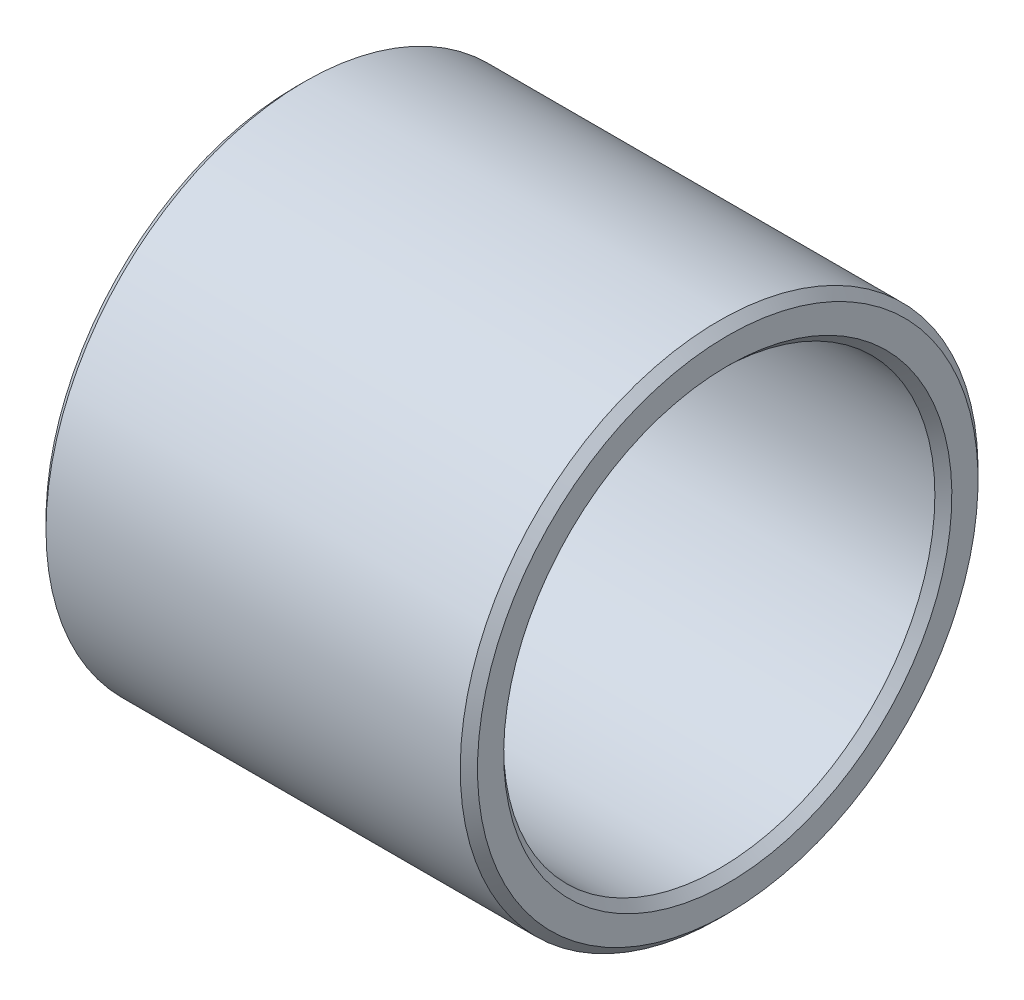
ISO-10303-21;
HEADER;
FILE_DESCRIPTION(('STEP AP214'),'2;1');
FILE_NAME('part.step','',(''),(''),'','','');
FILE_SCHEMA(('AUTOMOTIVE_DESIGN { 1 0 10303 214 1 1 1 1 }'));
ENDSEC;
DATA;
#1=APPLICATION_CONTEXT('core data for automotive mechanical design processes');
#2=APPLICATION_PROTOCOL_DEFINITION('international standard','automotive_design',2000,#1);
#3=PRODUCT_CONTEXT('',#1,'mechanical');
#4=PRODUCT('Part','Part','',(#3));
#5=PRODUCT_RELATED_PRODUCT_CATEGORY('part','',(#4));
#6=PRODUCT_DEFINITION_FORMATION('','',#4);
#7=PRODUCT_DEFINITION_CONTEXT('part definition',#1,'design');
#8=PRODUCT_DEFINITION('design','',#6,#7);
#9=PRODUCT_DEFINITION_SHAPE('','',#8);
#10=(LENGTH_UNIT() NAMED_UNIT(*) SI_UNIT(.MILLI.,.METRE.));
#11=(NAMED_UNIT(*) PLANE_ANGLE_UNIT() SI_UNIT($,.RADIAN.));
#12=(NAMED_UNIT(*) SI_UNIT($,.STERADIAN.) SOLID_ANGLE_UNIT());
#13=UNCERTAINTY_MEASURE_WITH_UNIT(LENGTH_MEASURE(1.E-05),#10,'distance_accuracy_value','');
#14=(GEOMETRIC_REPRESENTATION_CONTEXT(3) GLOBAL_UNCERTAINTY_ASSIGNED_CONTEXT((#13)) GLOBAL_UNIT_ASSIGNED_CONTEXT((#10,
#11,#12)) REPRESENTATION_CONTEXT('',''));
#15=CARTESIAN_POINT('',(0.,0.,0.));
#16=DIRECTION('',(0.,0.,1.));
#17=DIRECTION('',(1.,0.,0.));
#18=AXIS2_PLACEMENT_3D('',#15,#16,#17);
#19=CARTESIAN_POINT('',(-12.5,12.9828443874027,4.44089209850063E-13));
#20=DIRECTION('',(0.999999999999998,0.,0.));
#21=DIRECTION('',(0.,1.,0.));
#22=AXIS2_PLACEMENT_3D('',#19,#20,#21);
#23=PLANE('',#22);
#24=CARTESIAN_POINT('',(-12.5,0.,0.));
#25=DIRECTION('',(-0.999999999999998,0.,0.));
#26=DIRECTION('',(0.,-1.,0.));
#27=AXIS2_PLACEMENT_3D('',#24,#25,#26);
#28=CIRCLE('',#27,12.9828443874035);
#29=CARTESIAN_POINT('',(-12.5,-12.9828443874035,0.));
#30=VERTEX_POINT('',#29);
#31=EDGE_CURVE('E58',#30,#30,#28,.T.);
#32=ORIENTED_EDGE('',*,*,#31,.F.);
#33=EDGE_LOOP('',(#32));
#34=FACE_BOUND('',#33,.T.);
#35=CARTESIAN_POINT('',(-12.5,0.,0.));
#36=DIRECTION('',(-0.999999999999998,0.,0.));
#37=DIRECTION('',(0.,-1.,0.));
#38=AXIS2_PLACEMENT_3D('',#35,#36,#37);
#39=CIRCLE('',#38,14.5);
#40=CARTESIAN_POINT('',(-12.5,14.5,0.));
#41=VERTEX_POINT('',#40);
#42=EDGE_CURVE('E10',#41,#41,#39,.T.);
#43=ORIENTED_EDGE('',*,*,#42,.T.);
#44=EDGE_LOOP('',(#43));
#45=FACE_BOUND('',#44,.T.);
#46=ADVANCED_FACE('F30',(#34,#45),#23,.F.);
#47=CARTESIAN_POINT('',(-12.,0.,0.));
#48=DIRECTION('',(0.999999999999998,0.,0.));
#49=DIRECTION('',(0.,1.,0.));
#50=AXIS2_PLACEMENT_3D('',#47,#48,#49);
#51=CONICAL_SURFACE('',#50,15.,0.785398163397448);
#52=CARTESIAN_POINT('',(-12.,0.,0.));
#53=DIRECTION('',(-0.999999999999998,0.,0.));
#54=DIRECTION('',(0.,-1.,0.));
#55=AXIS2_PLACEMENT_3D('',#52,#53,#54);
#56=CIRCLE('',#55,15.);
#57=CARTESIAN_POINT('',(-12.,15.,0.));
#58=VERTEX_POINT('',#57);
#59=EDGE_CURVE('E36',#58,#58,#56,.T.);
#60=CARTESIAN_POINT('',(-12.5,14.5,0.));
#61=CARTESIAN_POINT('',(-12.4947916666667,14.5052083333333,0.));
#62=CARTESIAN_POINT('',(-12.4895833333333,14.5104166666667,0.));
#63=CARTESIAN_POINT('',(-12.4791666666667,14.5208333333333,0.));
#64=CARTESIAN_POINT('',(-12.4739583333333,14.5260416666667,0.));
#65=CARTESIAN_POINT('',(-12.4635416666667,14.5364583333333,0.));
#66=CARTESIAN_POINT('',(-12.4583333333333,14.5416666666667,0.));
#67=CARTESIAN_POINT('',(-12.4479166666667,14.5520833333333,0.));
#68=CARTESIAN_POINT('',(-12.4427083333333,14.5572916666667,0.));
#69=CARTESIAN_POINT('',(-12.4322916666667,14.5677083333333,0.));
#70=CARTESIAN_POINT('',(-12.4270833333333,14.5729166666667,0.));
#71=CARTESIAN_POINT('',(-12.4166666666667,14.5833333333333,0.));
#72=CARTESIAN_POINT('',(-12.4114583333333,14.5885416666667,0.));
#73=CARTESIAN_POINT('',(-12.4010416666667,14.5989583333333,0.));
#74=CARTESIAN_POINT('',(-12.3958333333333,14.6041666666667,0.));
#75=CARTESIAN_POINT('',(-12.3854166666667,14.6145833333333,0.));
#76=CARTESIAN_POINT('',(-12.3802083333333,14.6197916666667,0.));
#77=CARTESIAN_POINT('',(-12.3697916666667,14.6302083333333,0.));
#78=CARTESIAN_POINT('',(-12.3645833333333,14.6354166666667,0.));
#79=CARTESIAN_POINT('',(-12.3541666666667,14.6458333333333,0.));
#80=CARTESIAN_POINT('',(-12.3489583333333,14.6510416666667,0.));
#81=CARTESIAN_POINT('',(-12.3385416666667,14.6614583333333,0.));
#82=CARTESIAN_POINT('',(-12.3333333333333,14.6666666666667,0.));
#83=CARTESIAN_POINT('',(-12.3229166666667,14.6770833333333,0.));
#84=CARTESIAN_POINT('',(-12.3177083333333,14.6822916666667,0.));
#85=CARTESIAN_POINT('',(-12.3072916666667,14.6927083333333,0.));
#86=CARTESIAN_POINT('',(-12.3020833333333,14.6979166666667,0.));
#87=CARTESIAN_POINT('',(-12.2916666666667,14.7083333333333,0.));
#88=CARTESIAN_POINT('',(-12.2864583333333,14.7135416666667,0.));
#89=CARTESIAN_POINT('',(-12.2760416666667,14.7239583333333,0.));
#90=CARTESIAN_POINT('',(-12.2708333333333,14.7291666666667,0.));
#91=CARTESIAN_POINT('',(-12.2604166666667,14.7395833333333,0.));
#92=CARTESIAN_POINT('',(-12.2552083333333,14.7447916666667,0.));
#93=CARTESIAN_POINT('',(-12.2447916666667,14.7552083333333,0.));
#94=CARTESIAN_POINT('',(-12.2395833333333,14.7604166666667,0.));
#95=CARTESIAN_POINT('',(-12.2291666666667,14.7708333333333,0.));
#96=CARTESIAN_POINT('',(-12.2239583333333,14.7760416666667,0.));
#97=CARTESIAN_POINT('',(-12.2135416666667,14.7864583333333,0.));
#98=CARTESIAN_POINT('',(-12.2083333333333,14.7916666666667,0.));
#99=CARTESIAN_POINT('',(-12.1979166666667,14.8020833333333,0.));
#100=CARTESIAN_POINT('',(-12.1927083333333,14.8072916666667,0.));
#101=CARTESIAN_POINT('',(-12.1822916666667,14.8177083333333,0.));
#102=CARTESIAN_POINT('',(-12.1770833333333,14.8229166666667,0.));
#103=CARTESIAN_POINT('',(-12.1666666666667,14.8333333333333,0.));
#104=CARTESIAN_POINT('',(-12.1614583333333,14.8385416666667,0.));
#105=CARTESIAN_POINT('',(-12.1510416666667,14.8489583333333,0.));
#106=CARTESIAN_POINT('',(-12.1458333333333,14.8541666666667,0.));
#107=CARTESIAN_POINT('',(-12.1354166666667,14.8645833333333,0.));
#108=CARTESIAN_POINT('',(-12.1302083333333,14.8697916666667,0.));
#109=CARTESIAN_POINT('',(-12.1197916666667,14.8802083333333,0.));
#110=CARTESIAN_POINT('',(-12.1145833333333,14.8854166666667,0.));
#111=CARTESIAN_POINT('',(-12.1041666666667,14.8958333333333,0.));
#112=CARTESIAN_POINT('',(-12.0989583333333,14.9010416666667,0.));
#113=CARTESIAN_POINT('',(-12.0885416666667,14.9114583333333,0.));
#114=CARTESIAN_POINT('',(-12.0833333333333,14.9166666666667,0.));
#115=CARTESIAN_POINT('',(-12.0729166666667,14.9270833333333,0.));
#116=CARTESIAN_POINT('',(-12.0677083333333,14.9322916666667,0.));
#117=CARTESIAN_POINT('',(-12.0572916666667,14.9427083333333,0.));
#118=CARTESIAN_POINT('',(-12.0520833333333,14.9479166666667,0.));
#119=CARTESIAN_POINT('',(-12.0416666666667,14.9583333333333,0.));
#120=CARTESIAN_POINT('',(-12.0364583333333,14.9635416666667,0.));
#121=CARTESIAN_POINT('',(-12.0260416666667,14.9739583333333,0.));
#122=CARTESIAN_POINT('',(-12.0208333333333,14.9791666666667,0.));
#123=CARTESIAN_POINT('',(-12.0104166666667,14.9895833333333,0.));
#124=CARTESIAN_POINT('',(-12.0052083333333,14.9947916666667,0.));
#125=CARTESIAN_POINT('',(-12.,15.,0.));
#126=B_SPLINE_CURVE_WITH_KNOTS('',3,(#60,#61,#62,#63,#64,#65,#66,#67,#68,#69,#70,#71,#72,#73,
#74,#75,#76,#77,#78,#79,#80,#81,#82,#83,#84,#85,#86,#87,#88,#89,#90,#91,#92,#93,#94,#95,#96,#97,
#98,#99,#100,#101,#102,#103,#104,#105,#106,#107,#108,#109,#110,#111,#112,#113,#114,#115,#116,
#117,#118,#119,#120,#121,#122,#123,#124,#125),.UNSPECIFIED.,.F.,.F.,(4,2,2,2,2,2,2,2,2,2,2,2,2,
2,2,2,2,2,2,2,2,2,2,2,2,2,2,2,2,2,2,2,4),(0.,0.0220970869120796,0.0441941738241593,
0.0662912607362389,0.0883883476483185,0.110485434560398,0.132582521472478,0.154679608384557,
0.176776695296637,0.198873782208717,0.220970869120796,0.243067956032876,0.265165042944956,
0.287262129857035,0.309359216769115,0.331456303681195,0.353553390593274,0.375650477505354,
0.397747564417433,0.419844651329513,0.441941738241593,0.464038825153672,0.486135912065752,
0.508232998977832,0.530330085889911,0.552427172801991,0.574524259714071,0.59662134662615,
0.61871843353823,0.640815520450308,0.662912607362389,0.685009694274469,0.70710678118655),.UNSPECIFIED.);
#127=EDGE_CURVE('BSEAM65',#41,#58,#126,.T.);
#128=ORIENTED_EDGE('',*,*,#42,.F.);
#129=ORIENTED_EDGE('',*,*,#59,.T.);
#130=ORIENTED_EDGE('',*,*,#127,.T.);
#131=ORIENTED_EDGE('',*,*,#127,.F.);
#132=EDGE_LOOP('',(#128,#130,#129,#131));
#133=FACE_BOUND('',#132,.T.);
#134=ADVANCED_FACE('F65',(#133),#51,.T.);
#135=CARTESIAN_POINT('',(-12.5,0.,0.));
#136=DIRECTION('',(-0.999999999999998,0.,0.));
#137=DIRECTION('',(0.,-1.,0.));
#138=AXIS2_PLACEMENT_3D('',#135,#136,#137);
#139=CYLINDRICAL_SURFACE('',#138,15.);
#140=ORIENTED_EDGE('',*,*,#59,.F.);
#141=EDGE_LOOP('',(#140));
#142=FACE_BOUND('',#141,.T.);
#143=CARTESIAN_POINT('',(12.,0.,0.));
#144=DIRECTION('',(-0.999999999999998,0.,0.));
#145=DIRECTION('',(0.,-1.,0.));
#146=AXIS2_PLACEMENT_3D('',#143,#144,#145);
#147=CIRCLE('',#146,15.);
#148=CARTESIAN_POINT('',(12.,-15.,0.));
#149=VERTEX_POINT('',#148);
#150=EDGE_CURVE('E40',#149,#149,#147,.T.);
#151=ORIENTED_EDGE('',*,*,#150,.T.);
#152=EDGE_LOOP('',(#151));
#153=FACE_BOUND('',#152,.T.);
#154=ADVANCED_FACE('F69',(#142,#153),#139,.T.);
#155=CARTESIAN_POINT('',(12.5,0.,0.));
#156=DIRECTION('',(-0.999999999999998,0.,0.));
#157=DIRECTION('',(0.,-1.,0.));
#158=AXIS2_PLACEMENT_3D('',#155,#156,#157);
#159=CONICAL_SURFACE('',#158,14.5,0.785398163397448);
#160=CARTESIAN_POINT('',(12.5,0.,0.));
#161=DIRECTION('',(-0.999999999999998,0.,0.));
#162=DIRECTION('',(0.,-1.,0.));
#163=AXIS2_PLACEMENT_3D('',#160,#161,#162);
#164=CIRCLE('',#163,14.5);
#165=CARTESIAN_POINT('',(12.5,-14.5,0.));
#166=VERTEX_POINT('',#165);
#167=EDGE_CURVE('E44',#166,#166,#164,.T.);
#168=CARTESIAN_POINT('',(12.,-15.,0.));
#169=CARTESIAN_POINT('',(12.0052083333333,-14.9947916666667,0.));
#170=CARTESIAN_POINT('',(12.0104166666667,-14.9895833333333,0.));
#171=CARTESIAN_POINT('',(12.0208333333333,-14.9791666666667,0.));
#172=CARTESIAN_POINT('',(12.0260416666667,-14.9739583333333,0.));
#173=CARTESIAN_POINT('',(12.0364583333333,-14.9635416666667,0.));
#174=CARTESIAN_POINT('',(12.0416666666667,-14.9583333333333,0.));
#175=CARTESIAN_POINT('',(12.0520833333333,-14.9479166666667,0.));
#176=CARTESIAN_POINT('',(12.0572916666667,-14.9427083333333,0.));
#177=CARTESIAN_POINT('',(12.0677083333333,-14.9322916666667,0.));
#178=CARTESIAN_POINT('',(12.0729166666667,-14.9270833333333,0.));
#179=CARTESIAN_POINT('',(12.0833333333333,-14.9166666666667,0.));
#180=CARTESIAN_POINT('',(12.0885416666667,-14.9114583333333,0.));
#181=CARTESIAN_POINT('',(12.0989583333333,-14.9010416666667,0.));
#182=CARTESIAN_POINT('',(12.1041666666667,-14.8958333333333,0.));
#183=CARTESIAN_POINT('',(12.1145833333333,-14.8854166666667,0.));
#184=CARTESIAN_POINT('',(12.1197916666667,-14.8802083333333,0.));
#185=CARTESIAN_POINT('',(12.1302083333333,-14.8697916666667,0.));
#186=CARTESIAN_POINT('',(12.1354166666667,-14.8645833333333,0.));
#187=CARTESIAN_POINT('',(12.1458333333333,-14.8541666666667,0.));
#188=CARTESIAN_POINT('',(12.1510416666667,-14.8489583333333,0.));
#189=CARTESIAN_POINT('',(12.1614583333333,-14.8385416666667,0.));
#190=CARTESIAN_POINT('',(12.1666666666667,-14.8333333333333,0.));
#191=CARTESIAN_POINT('',(12.1770833333333,-14.8229166666667,0.));
#192=CARTESIAN_POINT('',(12.1822916666667,-14.8177083333333,0.));
#193=CARTESIAN_POINT('',(12.1927083333333,-14.8072916666667,0.));
#194=CARTESIAN_POINT('',(12.1979166666667,-14.8020833333333,0.));
#195=CARTESIAN_POINT('',(12.2083333333333,-14.7916666666667,0.));
#196=CARTESIAN_POINT('',(12.2135416666667,-14.7864583333333,0.));
#197=CARTESIAN_POINT('',(12.2239583333333,-14.7760416666667,0.));
#198=CARTESIAN_POINT('',(12.2291666666667,-14.7708333333333,0.));
#199=CARTESIAN_POINT('',(12.2395833333333,-14.7604166666667,0.));
#200=CARTESIAN_POINT('',(12.2447916666667,-14.7552083333333,0.));
#201=CARTESIAN_POINT('',(12.2552083333333,-14.7447916666667,0.));
#202=CARTESIAN_POINT('',(12.2604166666667,-14.7395833333333,0.));
#203=CARTESIAN_POINT('',(12.2708333333333,-14.7291666666667,0.));
#204=CARTESIAN_POINT('',(12.2760416666667,-14.7239583333333,0.));
#205=CARTESIAN_POINT('',(12.2864583333333,-14.7135416666667,0.));
#206=CARTESIAN_POINT('',(12.2916666666667,-14.7083333333333,0.));
#207=CARTESIAN_POINT('',(12.3020833333333,-14.6979166666667,0.));
#208=CARTESIAN_POINT('',(12.3072916666667,-14.6927083333333,0.));
#209=CARTESIAN_POINT('',(12.3177083333333,-14.6822916666667,0.));
#210=CARTESIAN_POINT('',(12.3229166666667,-14.6770833333333,0.));
#211=CARTESIAN_POINT('',(12.3333333333333,-14.6666666666667,0.));
#212=CARTESIAN_POINT('',(12.3385416666667,-14.6614583333333,0.));
#213=CARTESIAN_POINT('',(12.3489583333333,-14.6510416666667,0.));
#214=CARTESIAN_POINT('',(12.3541666666667,-14.6458333333333,0.));
#215=CARTESIAN_POINT('',(12.3645833333333,-14.6354166666667,0.));
#216=CARTESIAN_POINT('',(12.3697916666667,-14.6302083333333,0.));
#217=CARTESIAN_POINT('',(12.3802083333333,-14.6197916666667,0.));
#218=CARTESIAN_POINT('',(12.3854166666667,-14.6145833333333,0.));
#219=CARTESIAN_POINT('',(12.3958333333333,-14.6041666666667,0.));
#220=CARTESIAN_POINT('',(12.4010416666667,-14.5989583333333,0.));
#221=CARTESIAN_POINT('',(12.4114583333333,-14.5885416666667,0.));
#222=CARTESIAN_POINT('',(12.4166666666667,-14.5833333333333,0.));
#223=CARTESIAN_POINT('',(12.4270833333333,-14.5729166666667,0.));
#224=CARTESIAN_POINT('',(12.4322916666667,-14.5677083333333,0.));
#225=CARTESIAN_POINT('',(12.4427083333333,-14.5572916666667,0.));
#226=CARTESIAN_POINT('',(12.4479166666667,-14.5520833333333,0.));
#227=CARTESIAN_POINT('',(12.4583333333333,-14.5416666666667,0.));
#228=CARTESIAN_POINT('',(12.4635416666667,-14.5364583333333,0.));
#229=CARTESIAN_POINT('',(12.4739583333333,-14.5260416666667,0.));
#230=CARTESIAN_POINT('',(12.4791666666667,-14.5208333333333,0.));
#231=CARTESIAN_POINT('',(12.4895833333333,-14.5104166666667,0.));
#232=CARTESIAN_POINT('',(12.4947916666667,-14.5052083333333,0.));
#233=CARTESIAN_POINT('',(12.5,-14.5,0.));
#234=B_SPLINE_CURVE_WITH_KNOTS('',3,(#168,#169,#170,#171,#172,#173,#174,#175,#176,#177,#178,
#179,#180,#181,#182,#183,#184,#185,#186,#187,#188,#189,#190,#191,#192,#193,#194,#195,#196,#197,
#198,#199,#200,#201,#202,#203,#204,#205,#206,#207,#208,#209,#210,#211,#212,#213,#214,#215,#216,
#217,#218,#219,#220,#221,#222,#223,#224,#225,#226,#227,#228,#229,#230,#231,#232,#233),
.UNSPECIFIED.,.F.,.F.,(4,2,2,2,2,2,2,2,2,2,2,2,2,2,2,2,2,2,2,2,2,2,2,2,2,2,2,2,2,2,2,2,4),(0.,
0.0220970869120796,0.0441941738241593,0.0662912607362389,0.0883883476483185,0.110485434560398,
0.132582521472478,0.154679608384557,0.176776695296637,0.198873782208717,0.220970869120796,
0.243067956032876,0.265165042944957,0.287262129857035,0.309359216769115,0.331456303681194,
0.353553390593274,0.375650477505354,0.397747564417433,0.419844651329513,0.441941738241593,
0.464038825153672,0.486135912065753,0.508232998977832,0.530330085889911,0.552427172801991,
0.574524259714071,0.59662134662615,0.618718433538231,0.640815520450309,0.66291260736239,
0.685009694274469,0.707106781186548),.UNSPECIFIED.);
#235=EDGE_CURVE('BSEAM74',#149,#166,#234,.T.);
#236=ORIENTED_EDGE('',*,*,#150,.F.);
#237=ORIENTED_EDGE('',*,*,#167,.T.);
#238=ORIENTED_EDGE('',*,*,#235,.T.);
#239=ORIENTED_EDGE('',*,*,#235,.F.);
#240=EDGE_LOOP('',(#236,#238,#237,#239));
#241=FACE_BOUND('',#240,.T.);
#242=ADVANCED_FACE('F74',(#241),#159,.T.);
#243=CARTESIAN_POINT('',(12.5,14.5,4.44089209850063E-13));
#244=DIRECTION('',(-0.999999999999998,0.,0.));
#245=DIRECTION('',(0.,-1.,0.));
#246=AXIS2_PLACEMENT_3D('',#243,#244,#245);
#247=PLANE('',#246);
#248=ORIENTED_EDGE('',*,*,#167,.F.);
#249=EDGE_LOOP('',(#248));
#250=FACE_BOUND('',#249,.T.);
#251=CARTESIAN_POINT('',(12.5,0.,0.));
#252=DIRECTION('',(-0.999999999999998,0.,0.));
#253=DIRECTION('',(0.,-1.,0.));
#254=AXIS2_PLACEMENT_3D('',#251,#252,#253);
#255=CIRCLE('',#254,12.9828443874035);
#256=CARTESIAN_POINT('',(12.5,12.9828443874035,0.));
#257=VERTEX_POINT('',#256);
#258=EDGE_CURVE('E49',#257,#257,#255,.T.);
#259=ORIENTED_EDGE('',*,*,#258,.T.);
#260=EDGE_LOOP('',(#259));
#261=FACE_BOUND('',#260,.T.);
#262=ADVANCED_FACE('F80',(#250,#261),#247,.F.);
#263=CARTESIAN_POINT('',(12.,0.,0.));
#264=DIRECTION('',(0.999999999999998,0.,0.));
#265=DIRECTION('',(0.,1.,0.));
#266=AXIS2_PLACEMENT_3D('',#263,#264,#265);
#267=CONICAL_SURFACE('',#266,12.5,0.767944870877507);
#268=CARTESIAN_POINT('',(12.,0.,0.));
#269=DIRECTION('',(-0.999999999999998,0.,0.));
#270=DIRECTION('',(0.,-1.,0.));
#271=AXIS2_PLACEMENT_3D('',#268,#269,#270);
#272=CIRCLE('',#271,12.5);
#273=CARTESIAN_POINT('',(12.,12.5,0.));
#274=VERTEX_POINT('',#273);
#275=EDGE_CURVE('E52',#274,#274,#272,.T.);
#276=CARTESIAN_POINT('',(12.5,12.9828443874035,0.));
#277=CARTESIAN_POINT('',(12.4947916666667,12.9778147583681,0.));
#278=CARTESIAN_POINT('',(12.4895833333333,12.9727851293326,0.));
#279=CARTESIAN_POINT('',(12.4791666666667,12.9627258712617,0.));
#280=CARTESIAN_POINT('',(12.4739583333333,12.9576962422263,0.));
#281=CARTESIAN_POINT('',(12.4635416666667,12.9476369841554,0.));
#282=CARTESIAN_POINT('',(12.4583333333333,12.9426073551199,0.));
#283=CARTESIAN_POINT('',(12.4479166666667,12.932548097049,0.));
#284=CARTESIAN_POINT('',(12.4427083333333,12.9275184680136,0.));
#285=CARTESIAN_POINT('',(12.4322916666667,12.9174592099426,0.));
#286=CARTESIAN_POINT('',(12.4270833333333,12.9124295809072,0.));
#287=CARTESIAN_POINT('',(12.4166666666667,12.9023703228363,0.));
#288=CARTESIAN_POINT('',(12.4114583333333,12.8973406938008,0.));
#289=CARTESIAN_POINT('',(12.4010416666667,12.8872814357299,0.));
#290=CARTESIAN_POINT('',(12.3958333333333,12.8822518066945,0.));
#291=CARTESIAN_POINT('',(12.3854166666667,12.8721925486236,0.));
#292=CARTESIAN_POINT('',(12.3802083333333,12.8671629195881,0.));
#293=CARTESIAN_POINT('',(12.3697916666667,12.8571036615172,0.));
#294=CARTESIAN_POINT('',(12.3645833333333,12.8520740324817,0.));
#295=CARTESIAN_POINT('',(12.3541666666667,12.8420147744108,0.));
#296=CARTESIAN_POINT('',(12.3489583333333,12.8369851453754,0.));
#297=CARTESIAN_POINT('',(12.3385416666667,12.8269258873045,0.));
#298=CARTESIAN_POINT('',(12.3333333333333,12.821896258269,0.));
#299=CARTESIAN_POINT('',(12.3229166666667,12.8118370001981,0.));
#300=CARTESIAN_POINT('',(12.3177083333333,12.8068073711627,0.));
#301=CARTESIAN_POINT('',(12.3072916666667,12.7967481130918,0.));
#302=CARTESIAN_POINT('',(12.3020833333333,12.7917184840563,0.));
#303=CARTESIAN_POINT('',(12.2916666666667,12.7816592259854,0.));
#304=CARTESIAN_POINT('',(12.2864583333333,12.7766295969499,0.));
#305=CARTESIAN_POINT('',(12.2760416666667,12.766570338879,0.));
#306=CARTESIAN_POINT('',(12.2708333333333,12.7615407098436,0.));
#307=CARTESIAN_POINT('',(12.2604166666667,12.7514814517727,0.));
#308=CARTESIAN_POINT('',(12.2552083333333,12.7464518227372,0.));
#309=CARTESIAN_POINT('',(12.2447916666667,12.7363925646663,0.));
#310=CARTESIAN_POINT('',(12.2395833333333,12.7313629356309,0.));
#311=CARTESIAN_POINT('',(12.2291666666667,12.72130367756,0.));
#312=CARTESIAN_POINT('',(12.2239583333333,12.7162740485245,0.));
#313=CARTESIAN_POINT('',(12.2135416666667,12.7062147904536,0.));
#314=CARTESIAN_POINT('',(12.2083333333333,12.7011851614181,0.));
#315=CARTESIAN_POINT('',(12.1979166666667,12.6911259033472,0.));
#316=CARTESIAN_POINT('',(12.1927083333333,12.6860962743118,0.));
#317=CARTESIAN_POINT('',(12.1822916666667,12.6760370162409,0.));
#318=CARTESIAN_POINT('',(12.1770833333333,12.6710073872054,0.));
#319=CARTESIAN_POINT('',(12.1666666666667,12.6609481291345,0.));
#320=CARTESIAN_POINT('',(12.1614583333333,12.6559185000991,0.));
#321=CARTESIAN_POINT('',(12.1510416666667,12.6458592420282,0.));
#322=CARTESIAN_POINT('',(12.1458333333333,12.6408296129927,0.));
#323=CARTESIAN_POINT('',(12.1354166666667,12.6307703549218,0.));
#324=CARTESIAN_POINT('',(12.1302083333333,12.6257407258863,0.));
#325=CARTESIAN_POINT('',(12.1197916666667,12.6156814678154,0.));
#326=CARTESIAN_POINT('',(12.1145833333333,12.61065183878,0.));
#327=CARTESIAN_POINT('',(12.1041666666667,12.6005925807091,0.));
#328=CARTESIAN_POINT('',(12.0989583333333,12.5955629516736,0.));
#329=CARTESIAN_POINT('',(12.0885416666667,12.5855036936027,0.));
#330=CARTESIAN_POINT('',(12.0833333333333,12.5804740645673,0.));
#331=CARTESIAN_POINT('',(12.0729166666667,12.5704148064963,0.));
#332=CARTESIAN_POINT('',(12.0677083333333,12.5653851774609,0.));
#333=CARTESIAN_POINT('',(12.0572916666667,12.55532591939,0.));
#334=CARTESIAN_POINT('',(12.0520833333333,12.5502962903545,0.));
#335=CARTESIAN_POINT('',(12.0416666666667,12.5402370322836,0.));
#336=CARTESIAN_POINT('',(12.0364583333333,12.5352074032482,0.));
#337=CARTESIAN_POINT('',(12.0260416666667,12.5251481451773,0.));
#338=CARTESIAN_POINT('',(12.0208333333333,12.5201185161418,0.));
#339=CARTESIAN_POINT('',(12.0104166666667,12.5100592580709,0.));
#340=CARTESIAN_POINT('',(12.0052083333333,12.5050296290355,0.));
#341=CARTESIAN_POINT('',(12.,12.5,0.));
#342=B_SPLINE_CURVE_WITH_KNOTS('',3,(#276,#277,#278,#279,#280,#281,#282,#283,#284,#285,#286,
#287,#288,#289,#290,#291,#292,#293,#294,#295,#296,#297,#298,#299,#300,#301,#302,#303,#304,#305,
#306,#307,#308,#309,#310,#311,#312,#313,#314,#315,#316,#317,#318,#319,#320,#321,#322,#323,#324,
#325,#326,#327,#328,#329,#330,#331,#332,#333,#334,#335,#336,#337,#338,#339,#340,#341),
.UNSPECIFIED.,.F.,.F.,(4,2,2,2,2,2,2,2,2,2,2,2,2,2,2,2,2,2,2,2,2,2,2,2,2,2,2,2,2,2,2,2,4),(0.,
0.0217213061096356,0.0434426122192712,0.0651639183289068,0.0868852244385424,0.108606530548178,
0.130327836657815,0.15204914276745,0.173770448877086,0.195491754986722,0.217213061096357,
0.238934367205993,0.260655673315628,0.282376979425264,0.304098285534899,0.325819591644535,
0.347540897754171,0.369262203863806,0.390983509973442,0.412704816083079,0.434426122192714,
0.45614742830235,0.477868734411985,0.499590040521621,0.521311346631256,0.543032652740892,
0.564753958850528,0.586475264960163,0.608196571069799,0.629917877179433,0.65163918328907,
0.673360489398706,0.695081795508342),.UNSPECIFIED.);
#343=EDGE_CURVE('BSEAM84',#257,#274,#342,.T.);
#344=ORIENTED_EDGE('',*,*,#258,.F.);
#345=ORIENTED_EDGE('',*,*,#275,.T.);
#346=ORIENTED_EDGE('',*,*,#343,.T.);
#347=ORIENTED_EDGE('',*,*,#343,.F.);
#348=EDGE_LOOP('',(#344,#346,#345,#347));
#349=FACE_BOUND('',#348,.T.);
#350=ADVANCED_FACE('F84',(#349),#267,.F.);
#351=CARTESIAN_POINT('',(-12.5,0.,0.));
#352=DIRECTION('',(-0.999999999999998,0.,0.));
#353=DIRECTION('',(0.,-1.,0.));
#354=AXIS2_PLACEMENT_3D('',#351,#352,#353);
#355=CYLINDRICAL_SURFACE('',#354,12.5);
#356=ORIENTED_EDGE('',*,*,#275,.F.);
#357=EDGE_LOOP('',(#356));
#358=FACE_BOUND('',#357,.T.);
#359=CARTESIAN_POINT('',(-12.,0.,0.));
#360=DIRECTION('',(-0.999999999999998,0.,0.));
#361=DIRECTION('',(0.,-1.,0.));
#362=AXIS2_PLACEMENT_3D('',#359,#360,#361);
#363=CIRCLE('',#362,12.5);
#364=CARTESIAN_POINT('',(-12.,-12.5,0.));
#365=VERTEX_POINT('',#364);
#366=EDGE_CURVE('E55',#365,#365,#363,.T.);
#367=ORIENTED_EDGE('',*,*,#366,.T.);
#368=EDGE_LOOP('',(#367));
#369=FACE_BOUND('',#368,.T.);
#370=ADVANCED_FACE('F88',(#358,#369),#355,.F.);
#371=CARTESIAN_POINT('',(-12.5,0.,0.));
#372=DIRECTION('',(-0.999999999999998,0.,0.));
#373=DIRECTION('',(0.,-1.,0.));
#374=AXIS2_PLACEMENT_3D('',#371,#372,#373);
#375=CONICAL_SURFACE('',#374,12.9828443874035,0.767944870877509);
#376=CARTESIAN_POINT('',(-12.,-12.5,0.));
#377=CARTESIAN_POINT('',(-12.0052083333333,-12.5050296290354,0.));
#378=CARTESIAN_POINT('',(-12.0104166666667,-12.5100592580709,0.));
#379=CARTESIAN_POINT('',(-12.0208333333333,-12.5201185161418,0.));
#380=CARTESIAN_POINT('',(-12.0260416666667,-12.5251481451773,0.));
#381=CARTESIAN_POINT('',(-12.0364583333333,-12.5352074032482,0.));
#382=CARTESIAN_POINT('',(-12.0416666666667,-12.5402370322836,0.));
#383=CARTESIAN_POINT('',(-12.0520833333333,-12.5502962903545,0.));
#384=CARTESIAN_POINT('',(-12.0572916666667,-12.55532591939,0.));
#385=CARTESIAN_POINT('',(-12.0677083333333,-12.5653851774609,0.));
#386=CARTESIAN_POINT('',(-12.0729166666667,-12.5704148064963,0.));
#387=CARTESIAN_POINT('',(-12.0833333333333,-12.5804740645673,0.));
#388=CARTESIAN_POINT('',(-12.0885416666667,-12.5855036936027,0.));
#389=CARTESIAN_POINT('',(-12.0989583333333,-12.5955629516736,0.));
#390=CARTESIAN_POINT('',(-12.1041666666667,-12.6005925807091,0.));
#391=CARTESIAN_POINT('',(-12.1145833333333,-12.61065183878,0.));
#392=CARTESIAN_POINT('',(-12.1197916666667,-12.6156814678154,0.));
#393=CARTESIAN_POINT('',(-12.1302083333333,-12.6257407258863,0.));
#394=CARTESIAN_POINT('',(-12.1354166666667,-12.6307703549218,0.));
#395=CARTESIAN_POINT('',(-12.1458333333333,-12.6408296129927,0.));
#396=CARTESIAN_POINT('',(-12.1510416666667,-12.6458592420281,0.));
#397=CARTESIAN_POINT('',(-12.1614583333333,-12.6559185000991,0.));
#398=CARTESIAN_POINT('',(-12.1666666666667,-12.6609481291345,0.));
#399=CARTESIAN_POINT('',(-12.1770833333333,-12.6710073872054,0.));
#400=CARTESIAN_POINT('',(-12.1822916666667,-12.6760370162409,0.));
#401=CARTESIAN_POINT('',(-12.1927083333333,-12.6860962743118,0.));
#402=CARTESIAN_POINT('',(-12.1979166666667,-12.6911259033472,0.));
#403=CARTESIAN_POINT('',(-12.2083333333333,-12.7011851614181,0.));
#404=CARTESIAN_POINT('',(-12.2135416666667,-12.7062147904536,0.));
#405=CARTESIAN_POINT('',(-12.2239583333333,-12.7162740485245,0.));
#406=CARTESIAN_POINT('',(-12.2291666666667,-12.72130367756,0.));
#407=CARTESIAN_POINT('',(-12.2395833333333,-12.7313629356309,0.));
#408=CARTESIAN_POINT('',(-12.2447916666667,-12.7363925646663,0.));
#409=CARTESIAN_POINT('',(-12.2552083333333,-12.7464518227372,0.));
#410=CARTESIAN_POINT('',(-12.2604166666667,-12.7514814517727,0.));
#411=CARTESIAN_POINT('',(-12.2708333333333,-12.7615407098436,0.));
#412=CARTESIAN_POINT('',(-12.2760416666667,-12.766570338879,0.));
#413=CARTESIAN_POINT('',(-12.2864583333333,-12.7766295969499,0.));
#414=CARTESIAN_POINT('',(-12.2916666666667,-12.7816592259854,0.));
#415=CARTESIAN_POINT('',(-12.3020833333333,-12.7917184840563,0.));
#416=CARTESIAN_POINT('',(-12.3072916666667,-12.7967481130918,0.));
#417=CARTESIAN_POINT('',(-12.3177083333333,-12.8068073711627,0.));
#418=CARTESIAN_POINT('',(-12.3229166666667,-12.8118370001981,0.));
#419=CARTESIAN_POINT('',(-12.3333333333333,-12.821896258269,0.));
#420=CARTESIAN_POINT('',(-12.3385416666667,-12.8269258873045,0.));
#421=CARTESIAN_POINT('',(-12.3489583333333,-12.8369851453754,0.));
#422=CARTESIAN_POINT('',(-12.3541666666667,-12.8420147744108,0.));
#423=CARTESIAN_POINT('',(-12.3645833333333,-12.8520740324817,0.));
#424=CARTESIAN_POINT('',(-12.3697916666667,-12.8571036615172,0.));
#425=CARTESIAN_POINT('',(-12.3802083333333,-12.8671629195881,0.));
#426=CARTESIAN_POINT('',(-12.3854166666667,-12.8721925486236,0.));
#427=CARTESIAN_POINT('',(-12.3958333333333,-12.8822518066945,0.));
#428=CARTESIAN_POINT('',(-12.4010416666667,-12.8872814357299,0.));
#429=CARTESIAN_POINT('',(-12.4114583333333,-12.8973406938008,0.));
#430=CARTESIAN_POINT('',(-12.4166666666667,-12.9023703228363,0.));
#431=CARTESIAN_POINT('',(-12.4270833333333,-12.9124295809072,0.));
#432=CARTESIAN_POINT('',(-12.4322916666667,-12.9174592099426,0.));
#433=CARTESIAN_POINT('',(-12.4427083333333,-12.9275184680135,0.));
#434=CARTESIAN_POINT('',(-12.4479166666667,-12.932548097049,0.));
#435=CARTESIAN_POINT('',(-12.4583333333333,-12.9426073551199,0.));
#436=CARTESIAN_POINT('',(-12.4635416666667,-12.9476369841554,0.));
#437=CARTESIAN_POINT('',(-12.4739583333333,-12.9576962422263,0.));
#438=CARTESIAN_POINT('',(-12.4791666666667,-12.9627258712617,0.));
#439=CARTESIAN_POINT('',(-12.4895833333333,-12.9727851293326,0.));
#440=CARTESIAN_POINT('',(-12.4947916666667,-12.9778147583681,0.));
#441=CARTESIAN_POINT('',(-12.5,-12.9828443874035,0.));
#442=B_SPLINE_CURVE_WITH_KNOTS('',3,(#376,#377,#378,#379,#380,#381,#382,#383,#384,#385,#386,
#387,#388,#389,#390,#391,#392,#393,#394,#395,#396,#397,#398,#399,#400,#401,#402,#403,#404,#405,
#406,#407,#408,#409,#410,#411,#412,#413,#414,#415,#416,#417,#418,#419,#420,#421,#422,#423,#424,
#425,#426,#427,#428,#429,#430,#431,#432,#433,#434,#435,#436,#437,#438,#439,#440,#441),
.UNSPECIFIED.,.F.,.F.,(4,2,2,2,2,2,2,2,2,2,2,2,2,2,2,2,2,2,2,2,2,2,2,2,2,2,2,2,2,2,2,2,4),(0.,
0.0217213061096356,0.0434426122192712,0.0651639183289068,0.0868852244385424,0.108606530548178,
0.130327836657815,0.15204914276745,0.173770448877086,0.195491754986722,0.217213061096357,
0.238934367205993,0.26065567331563,0.282376979425264,0.304098285534899,0.325819591644536,
0.347540897754172,0.369262203863807,0.390983509973443,0.412704816083079,0.434426122192714,
0.45614742830235,0.477868734411987,0.499590040521621,0.521311346631258,0.543032652740893,
0.564753958850529,0.586475264960165,0.608196571069801,0.629917877179436,0.651639183289072,
0.673360489398707,0.695081795508342),.UNSPECIFIED.);
#443=EDGE_CURVE('BSEAM62',#365,#30,#442,.T.);
#444=ORIENTED_EDGE('',*,*,#366,.F.);
#445=ORIENTED_EDGE('',*,*,#31,.T.);
#446=ORIENTED_EDGE('',*,*,#443,.T.);
#447=ORIENTED_EDGE('',*,*,#443,.F.);
#448=EDGE_LOOP('',(#444,#446,#445,#447));
#449=FACE_BOUND('',#448,.T.);
#450=ADVANCED_FACE('F62',(#449),#375,.F.);
#451=CLOSED_SHELL('',(#46,#134,#154,#242,#262,#350,#370,#450));
#452=MANIFOLD_SOLID_BREP('B2',#451);
#453=ADVANCED_BREP_SHAPE_REPRESENTATION('',(#18,#452),#14);
#454=SHAPE_DEFINITION_REPRESENTATION(#9,#453);
ENDSEC;
END-ISO-10303-21;
